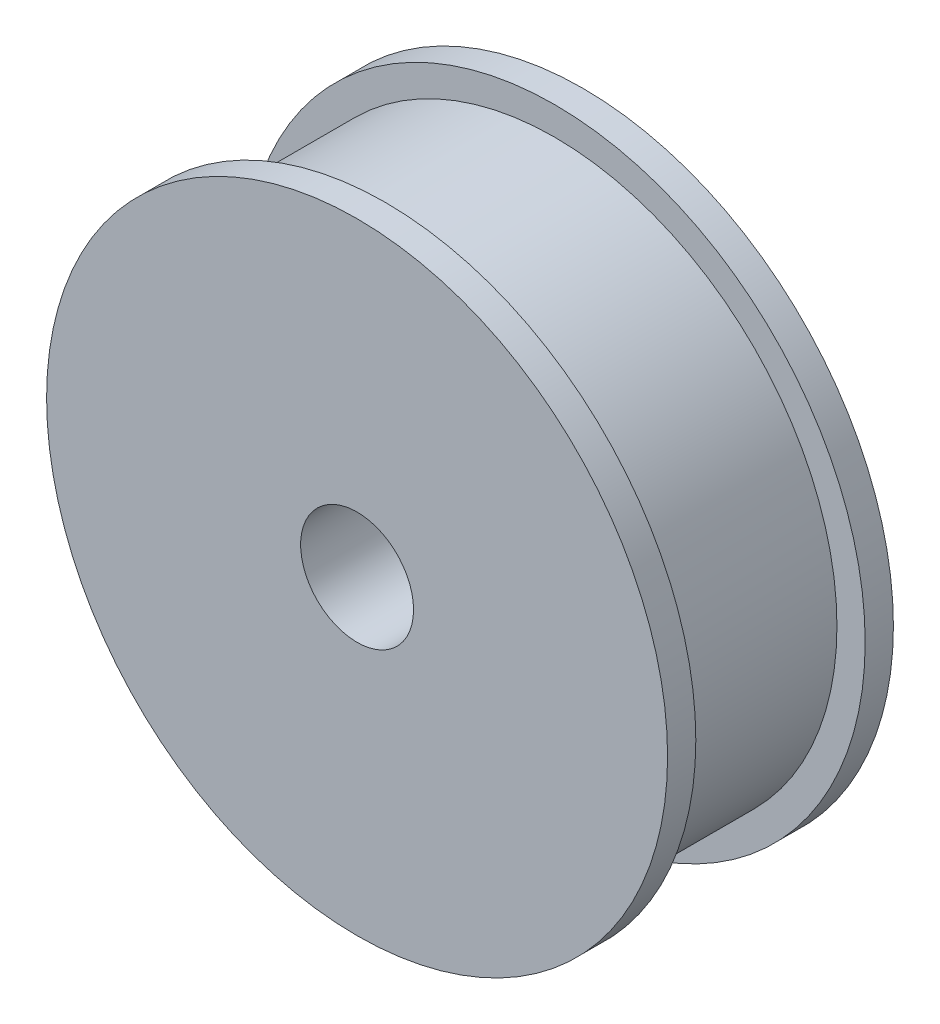
ISO-10303-21;
HEADER;
FILE_DESCRIPTION(('STEP AP214'),'2;1');
FILE_NAME('part.step','',(''),(''),'','','');
FILE_SCHEMA(('AUTOMOTIVE_DESIGN { 1 0 10303 214 1 1 1 1 }'));
ENDSEC;
DATA;
#1=APPLICATION_CONTEXT('core data for automotive mechanical design processes');
#2=APPLICATION_PROTOCOL_DEFINITION('international standard','automotive_design',2000,#1);
#3=PRODUCT_CONTEXT('',#1,'mechanical');
#4=PRODUCT('Part','Part','',(#3));
#5=PRODUCT_RELATED_PRODUCT_CATEGORY('part','',(#4));
#6=PRODUCT_DEFINITION_FORMATION('','',#4);
#7=PRODUCT_DEFINITION_CONTEXT('part definition',#1,'design');
#8=PRODUCT_DEFINITION('design','',#6,#7);
#9=PRODUCT_DEFINITION_SHAPE('','',#8);
#10=(LENGTH_UNIT() NAMED_UNIT(*) SI_UNIT(.MILLI.,.METRE.));
#11=(NAMED_UNIT(*) PLANE_ANGLE_UNIT() SI_UNIT($,.RADIAN.));
#12=(NAMED_UNIT(*) SI_UNIT($,.STERADIAN.) SOLID_ANGLE_UNIT());
#13=UNCERTAINTY_MEASURE_WITH_UNIT(LENGTH_MEASURE(1.E-05),#10,'distance_accuracy_value','');
#14=(GEOMETRIC_REPRESENTATION_CONTEXT(3) GLOBAL_UNCERTAINTY_ASSIGNED_CONTEXT((#13)) GLOBAL_UNIT_ASSIGNED_CONTEXT((#10,
#11,#12)) REPRESENTATION_CONTEXT('',''));
#15=CARTESIAN_POINT('',(0.,0.,0.));
#16=DIRECTION('',(0.,0.,1.));
#17=DIRECTION('',(1.,0.,0.));
#18=AXIS2_PLACEMENT_3D('',#15,#16,#17);
#19=CARTESIAN_POINT('',(0.,0.,12.));
#20=DIRECTION('',(0.,0.,-1.));
#21=DIRECTION('',(-1.,0.,0.));
#22=AXIS2_PLACEMENT_3D('',#19,#20,#21);
#23=CYLINDRICAL_SURFACE('',#22,16.5);
#24=CARTESIAN_POINT('',(0.,0.,10.5));
#25=DIRECTION('',(0.,0.,1.));
#26=DIRECTION('',(1.,0.,0.));
#27=AXIS2_PLACEMENT_3D('',#24,#25,#26);
#28=CIRCLE('',#27,16.5);
#29=CARTESIAN_POINT('',(16.5,0.,10.5));
#30=VERTEX_POINT('',#29);
#31=EDGE_CURVE('E34',#30,#30,#28,.T.);
#32=ORIENTED_EDGE('',*,*,#31,.T.);
#33=EDGE_LOOP('',(#32));
#34=FACE_BOUND('',#33,.T.);
#35=CARTESIAN_POINT('',(0.,0.,12.));
#36=DIRECTION('',(0.,0.,1.));
#37=DIRECTION('',(1.,0.,0.));
#38=AXIS2_PLACEMENT_3D('',#35,#36,#37);
#39=CIRCLE('',#38,16.5);
#40=CARTESIAN_POINT('',(16.5,0.,12.));
#41=VERTEX_POINT('',#40);
#42=EDGE_CURVE('E10',#41,#41,#39,.T.);
#43=ORIENTED_EDGE('',*,*,#42,.F.);
#44=EDGE_LOOP('',(#43));
#45=FACE_BOUND('',#44,.T.);
#46=ADVANCED_FACE('F31',(#34,#45),#23,.T.);
#47=CARTESIAN_POINT('',(0.,0.,12.));
#48=DIRECTION('',(0.,0.,1.));
#49=DIRECTION('',(1.,0.,0.));
#50=AXIS2_PLACEMENT_3D('',#47,#48,#49);
#51=PLANE('',#50);
#52=CARTESIAN_POINT('',(0.,0.,12.));
#53=DIRECTION('',(0.,0.,1.));
#54=DIRECTION('',(1.,0.,0.));
#55=AXIS2_PLACEMENT_3D('',#52,#53,#54);
#56=CIRCLE('',#55,3.);
#57=CARTESIAN_POINT('',(3.,0.,12.));
#58=VERTEX_POINT('',#57);
#59=EDGE_CURVE('E61',#58,#58,#56,.T.);
#60=ORIENTED_EDGE('',*,*,#59,.F.);
#61=EDGE_LOOP('',(#60));
#62=FACE_BOUND('',#61,.T.);
#63=ORIENTED_EDGE('',*,*,#42,.T.);
#64=EDGE_LOOP('',(#63));
#65=FACE_BOUND('',#64,.T.);
#66=ADVANCED_FACE('F69',(#62,#65),#51,.T.);
#67=CARTESIAN_POINT('',(0.,0.,10.5));
#68=DIRECTION('',(0.,0.,1.));
#69=DIRECTION('',(1.,0.,0.));
#70=AXIS2_PLACEMENT_3D('',#67,#68,#69);
#71=PLANE('',#70);
#72=CARTESIAN_POINT('',(0.,0.,10.5));
#73=DIRECTION('',(0.,0.,1.));
#74=DIRECTION('',(1.,0.,0.));
#75=AXIS2_PLACEMENT_3D('',#72,#73,#74);
#76=CIRCLE('',#75,15.);
#77=CARTESIAN_POINT('',(15.,0.,10.5));
#78=VERTEX_POINT('',#77);
#79=EDGE_CURVE('E45',#78,#78,#76,.T.);
#80=ORIENTED_EDGE('',*,*,#79,.T.);
#81=EDGE_LOOP('',(#80));
#82=FACE_BOUND('',#81,.T.);
#83=ORIENTED_EDGE('',*,*,#31,.F.);
#84=EDGE_LOOP('',(#83));
#85=FACE_BOUND('',#84,.T.);
#86=ADVANCED_FACE('F71',(#82,#85),#71,.F.);
#87=CARTESIAN_POINT('',(0.,0.,1.5));
#88=DIRECTION('',(0.,0.,1.));
#89=DIRECTION('',(1.,0.,0.));
#90=AXIS2_PLACEMENT_3D('',#87,#88,#89);
#91=PLANE('',#90);
#92=CARTESIAN_POINT('',(0.,0.,1.5));
#93=DIRECTION('',(0.,0.,1.));
#94=DIRECTION('',(1.,0.,0.));
#95=AXIS2_PLACEMENT_3D('',#92,#93,#94);
#96=CIRCLE('',#95,15.);
#97=CARTESIAN_POINT('',(15.,0.,1.5));
#98=VERTEX_POINT('',#97);
#99=EDGE_CURVE('E53',#98,#98,#96,.T.);
#100=ORIENTED_EDGE('',*,*,#99,.F.);
#101=EDGE_LOOP('',(#100));
#102=FACE_BOUND('',#101,.T.);
#103=CARTESIAN_POINT('',(0.,0.,1.5));
#104=DIRECTION('',(0.,0.,1.));
#105=DIRECTION('',(1.,0.,0.));
#106=AXIS2_PLACEMENT_3D('',#103,#104,#105);
#107=CIRCLE('',#106,16.5);
#108=CARTESIAN_POINT('',(16.5,0.,1.5));
#109=VERTEX_POINT('',#108);
#110=EDGE_CURVE('E47',#109,#109,#107,.T.);
#111=ORIENTED_EDGE('',*,*,#110,.T.);
#112=EDGE_LOOP('',(#111));
#113=FACE_BOUND('',#112,.T.);
#114=ADVANCED_FACE('F77',(#102,#113),#91,.T.);
#115=CARTESIAN_POINT('',(0.,0.,10.5));
#116=DIRECTION('',(0.,0.,-1.));
#117=DIRECTION('',(-1.,0.,0.));
#118=AXIS2_PLACEMENT_3D('',#115,#116,#117);
#119=CYLINDRICAL_SURFACE('',#118,15.);
#120=ORIENTED_EDGE('',*,*,#79,.F.);
#121=EDGE_LOOP('',(#120));
#122=FACE_BOUND('',#121,.T.);
#123=ORIENTED_EDGE('',*,*,#99,.T.);
#124=EDGE_LOOP('',(#123));
#125=FACE_BOUND('',#124,.T.);
#126=ADVANCED_FACE('F84',(#122,#125),#119,.T.);
#127=CARTESIAN_POINT('',(0.,0.,0.));
#128=DIRECTION('',(0.,0.,1.));
#129=DIRECTION('',(1.,0.,0.));
#130=AXIS2_PLACEMENT_3D('',#127,#128,#129);
#131=PLANE('',#130);
#132=CARTESIAN_POINT('',(0.,0.,0.));
#133=DIRECTION('',(0.,0.,1.));
#134=DIRECTION('',(1.,0.,0.));
#135=AXIS2_PLACEMENT_3D('',#132,#133,#134);
#136=CIRCLE('',#135,3.);
#137=CARTESIAN_POINT('',(3.,0.,0.));
#138=VERTEX_POINT('',#137);
#139=EDGE_CURVE('E57',#138,#138,#136,.T.);
#140=ORIENTED_EDGE('',*,*,#139,.T.);
#141=EDGE_LOOP('',(#140));
#142=FACE_BOUND('',#141,.T.);
#143=CARTESIAN_POINT('',(0.,0.,0.));
#144=DIRECTION('',(0.,0.,1.));
#145=DIRECTION('',(1.,0.,0.));
#146=AXIS2_PLACEMENT_3D('',#143,#144,#145);
#147=CIRCLE('',#146,16.5);
#148=CARTESIAN_POINT('',(16.5,0.,0.));
#149=VERTEX_POINT('',#148);
#150=EDGE_CURVE('E38',#149,#149,#147,.T.);
#151=ORIENTED_EDGE('',*,*,#150,.F.);
#152=EDGE_LOOP('',(#151));
#153=FACE_BOUND('',#152,.T.);
#154=ADVANCED_FACE('F82',(#142,#153),#131,.F.);
#155=ORIENTED_EDGE('',*,*,#150,.T.);
#156=EDGE_LOOP('',(#155));
#157=FACE_BOUND('',#156,.T.);
#158=ORIENTED_EDGE('',*,*,#110,.F.);
#159=EDGE_LOOP('',(#158));
#160=FACE_BOUND('',#159,.T.);
#161=ADVANCED_FACE('F80',(#157,#160),#23,.T.);
#162=CARTESIAN_POINT('',(0.,0.,0.));
#163=DIRECTION('',(0.,0.,1.));
#164=DIRECTION('',(1.,0.,0.));
#165=AXIS2_PLACEMENT_3D('',#162,#163,#164);
#166=CYLINDRICAL_SURFACE('',#165,3.);
#167=ORIENTED_EDGE('',*,*,#139,.F.);
#168=EDGE_LOOP('',(#167));
#169=FACE_BOUND('',#168,.T.);
#170=ORIENTED_EDGE('',*,*,#59,.T.);
#171=EDGE_LOOP('',(#170));
#172=FACE_BOUND('',#171,.T.);
#173=ADVANCED_FACE('F67',(#169,#172),#166,.F.);
#174=CLOSED_SHELL('',(#46,#66,#86,#114,#126,#154,#161,#173));
#175=MANIFOLD_SOLID_BREP('B2',#174);
#176=ADVANCED_BREP_SHAPE_REPRESENTATION('',(#18,#175),#14);
#177=SHAPE_DEFINITION_REPRESENTATION(#9,#176);
ENDSEC;
END-ISO-10303-21;
